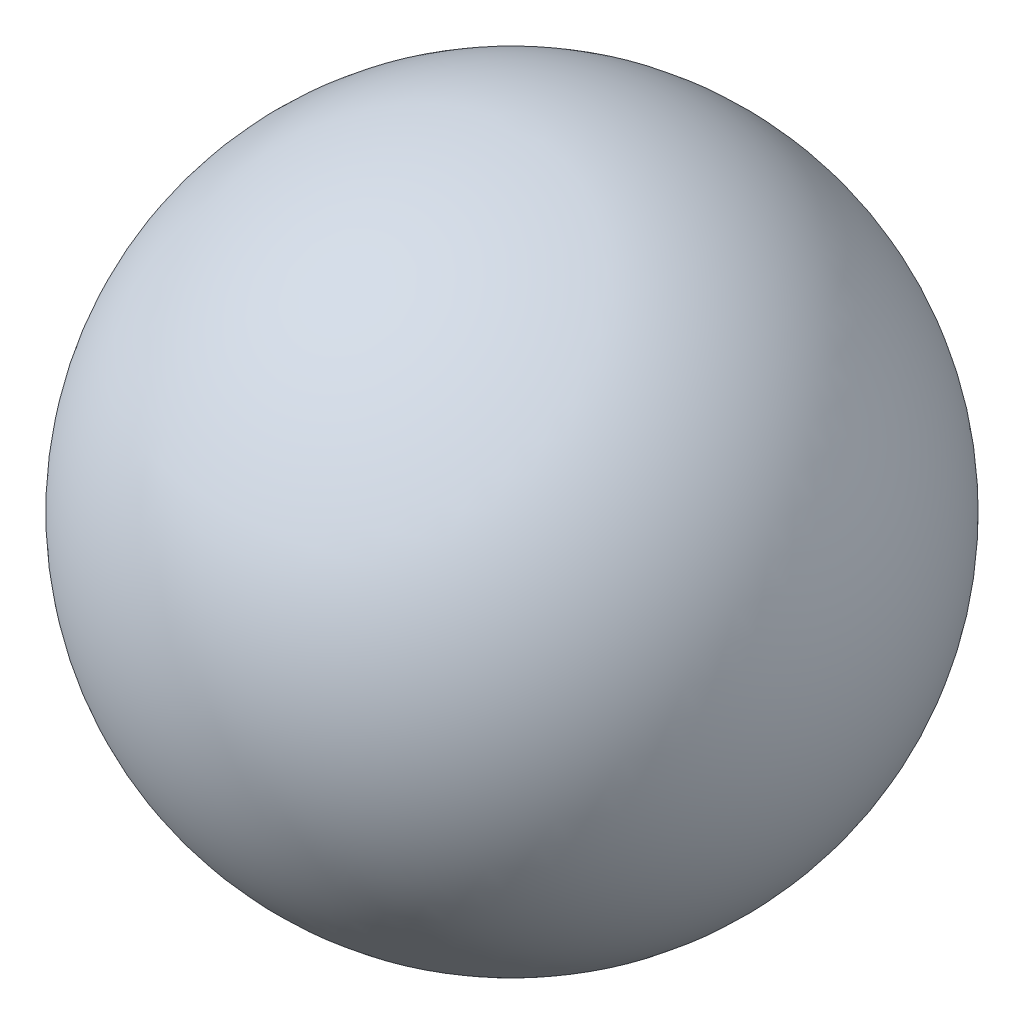
ISO-10303-21;
HEADER;
FILE_DESCRIPTION(('STEP AP214'),'2;1');
FILE_NAME('part.step','',(''),(''),'','','');
FILE_SCHEMA(('AUTOMOTIVE_DESIGN { 1 0 10303 214 1 1 1 1 }'));
ENDSEC;
DATA;
#1=APPLICATION_CONTEXT('core data for automotive mechanical design processes');
#2=APPLICATION_PROTOCOL_DEFINITION('international standard','automotive_design',2000,#1);
#3=PRODUCT_CONTEXT('',#1,'mechanical');
#4=PRODUCT('Part','Part','',(#3));
#5=PRODUCT_RELATED_PRODUCT_CATEGORY('part','',(#4));
#6=PRODUCT_DEFINITION_FORMATION('','',#4);
#7=PRODUCT_DEFINITION_CONTEXT('part definition',#1,'design');
#8=PRODUCT_DEFINITION('design','',#6,#7);
#9=PRODUCT_DEFINITION_SHAPE('','',#8);
#10=(LENGTH_UNIT() NAMED_UNIT(*) SI_UNIT(.MILLI.,.METRE.));
#11=(NAMED_UNIT(*) PLANE_ANGLE_UNIT() SI_UNIT($,.RADIAN.));
#12=(NAMED_UNIT(*) SI_UNIT($,.STERADIAN.) SOLID_ANGLE_UNIT());
#13=UNCERTAINTY_MEASURE_WITH_UNIT(LENGTH_MEASURE(1.E-05),#10,'distance_accuracy_value','');
#14=(GEOMETRIC_REPRESENTATION_CONTEXT(3) GLOBAL_UNCERTAINTY_ASSIGNED_CONTEXT((#13)) GLOBAL_UNIT_ASSIGNED_CONTEXT((#10,
#11,#12)) REPRESENTATION_CONTEXT('',''));
#15=CARTESIAN_POINT('',(0.,0.,0.));
#16=DIRECTION('',(0.,0.,1.));
#17=DIRECTION('',(1.,0.,0.));
#18=AXIS2_PLACEMENT_3D('',#15,#16,#17);
#19=CARTESIAN_POINT('',(0.,0.,0.));
#20=DIRECTION('',(0.,-1.,0.));
#21=DIRECTION('',(-1.,0.,0.));
#22=AXIS2_PLACEMENT_3D('',#19,#20,#21);
#23=SPHERICAL_SURFACE('',#22,36.1151882274876);
#24=CARTESIAN_POINT('',(0.,-36.1151882274876,0.));
#25=VERTEX_POINT('',#24);
#26=VERTEX_LOOP('',#25);
#27=FACE_BOUND('',#26,.T.);
#28=ADVANCED_FACE('F29',(#27),#23,.T.);
#29=CLOSED_SHELL('',(#28));
#30=MANIFOLD_SOLID_BREP('B2',#29);
#31=ADVANCED_BREP_SHAPE_REPRESENTATION('',(#18,#30),#14);
#32=SHAPE_DEFINITION_REPRESENTATION(#9,#31);
ENDSEC;
END-ISO-10303-21;
